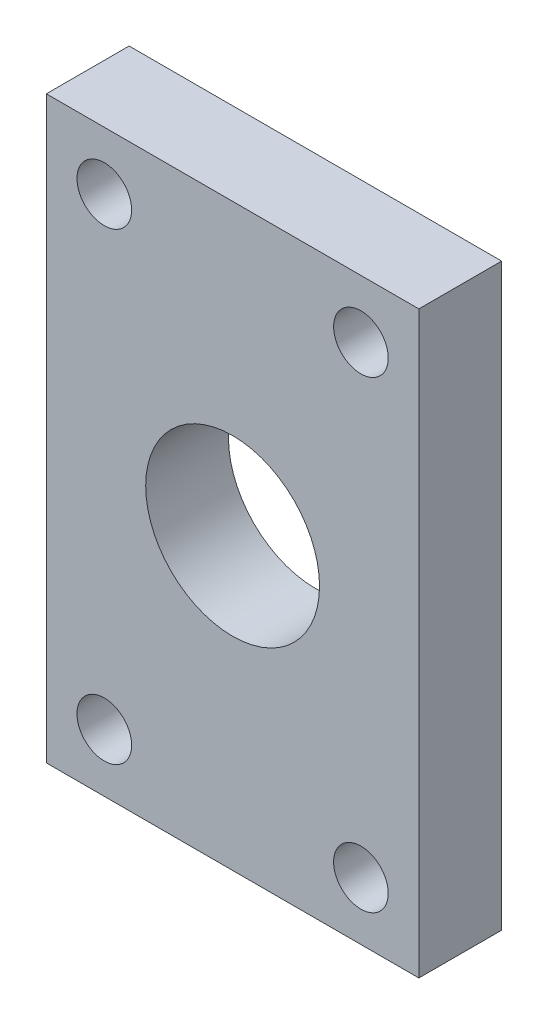
ISO-10303-21;
HEADER;
FILE_DESCRIPTION(('STEP AP214'),'2;1');
FILE_NAME('part.step','',(''),(''),'','','');
FILE_SCHEMA(('AUTOMOTIVE_DESIGN { 1 0 10303 214 1 1 1 1 }'));
ENDSEC;
DATA;
#1=APPLICATION_CONTEXT('core data for automotive mechanical design processes');
#2=APPLICATION_PROTOCOL_DEFINITION('international standard','automotive_design',2000,#1);
#3=PRODUCT_CONTEXT('',#1,'mechanical');
#4=PRODUCT('Part','Part','',(#3));
#5=PRODUCT_RELATED_PRODUCT_CATEGORY('part','',(#4));
#6=PRODUCT_DEFINITION_FORMATION('','',#4);
#7=PRODUCT_DEFINITION_CONTEXT('part definition',#1,'design');
#8=PRODUCT_DEFINITION('design','',#6,#7);
#9=PRODUCT_DEFINITION_SHAPE('','',#8);
#10=(LENGTH_UNIT() NAMED_UNIT(*) SI_UNIT(.MILLI.,.METRE.));
#11=(NAMED_UNIT(*) PLANE_ANGLE_UNIT() SI_UNIT($,.RADIAN.));
#12=(NAMED_UNIT(*) SI_UNIT($,.STERADIAN.) SOLID_ANGLE_UNIT());
#13=UNCERTAINTY_MEASURE_WITH_UNIT(LENGTH_MEASURE(1.E-05),#10,'distance_accuracy_value','');
#14=(GEOMETRIC_REPRESENTATION_CONTEXT(3) GLOBAL_UNCERTAINTY_ASSIGNED_CONTEXT((#13)) GLOBAL_UNIT_ASSIGNED_CONTEXT((#10,
#11,#12)) REPRESENTATION_CONTEXT('',''));
#15=CARTESIAN_POINT('',(0.,0.,0.));
#16=DIRECTION('',(0.,0.,1.));
#17=DIRECTION('',(1.,0.,0.));
#18=AXIS2_PLACEMENT_3D('',#15,#16,#17);
#19=CARTESIAN_POINT('',(0.,0.,-10.));
#20=DIRECTION('',(-1.,0.,0.));
#21=DIRECTION('',(0.,0.,1.));
#22=AXIS2_PLACEMENT_3D('',#19,#20,#21);
#23=PLANE('',#22);
#24=DIRECTION('',(0.,-1.,0.));
#25=VECTOR('',#24,1.);
#26=CARTESIAN_POINT('',(0.,0.,0.));
#27=LINE('',#26,#25);
#28=CARTESIAN_POINT('',(0.,70.,0.));
#29=VERTEX_POINT('',#28);
#30=CARTESIAN_POINT('',(0.,0.,0.));
#31=VERTEX_POINT('',#30);
#32=EDGE_CURVE('E97',#29,#31,#27,.T.);
#33=ORIENTED_EDGE('',*,*,#32,.F.);
#34=DIRECTION('',(0.,0.,1.));
#35=VECTOR('',#34,1.);
#36=CARTESIAN_POINT('',(0.,70.,-10.));
#37=LINE('',#36,#35);
#38=CARTESIAN_POINT('',(0.,70.,-10.));
#39=VERTEX_POINT('',#38);
#40=EDGE_CURVE('E11',#39,#29,#37,.T.);
#41=ORIENTED_EDGE('',*,*,#40,.F.);
#42=DIRECTION('',(0.,-1.,0.));
#43=VECTOR('',#42,1.);
#44=CARTESIAN_POINT('',(0.,0.,-10.));
#45=LINE('',#44,#43);
#46=CARTESIAN_POINT('',(0.,0.,-10.));
#47=VERTEX_POINT('',#46);
#48=EDGE_CURVE('E90',#39,#47,#45,.T.);
#49=ORIENTED_EDGE('',*,*,#48,.T.);
#50=DIRECTION('',(0.,0.,1.));
#51=VECTOR('',#50,1.);
#52=CARTESIAN_POINT('',(0.,0.,-10.));
#53=LINE('',#52,#51);
#54=EDGE_CURVE('E35',#47,#31,#53,.T.);
#55=ORIENTED_EDGE('',*,*,#54,.T.);
#56=EDGE_LOOP('',(#33,#41,#49,#55));
#57=FACE_BOUND('',#56,.T.);
#58=ADVANCED_FACE('F32',(#57),#23,.T.);
#59=CARTESIAN_POINT('',(0.,70.,-10.));
#60=DIRECTION('',(0.,1.,0.));
#61=DIRECTION('',(0.,0.,1.));
#62=AXIS2_PLACEMENT_3D('',#59,#60,#61);
#63=PLANE('',#62);
#64=DIRECTION('',(-1.,0.,0.));
#65=VECTOR('',#64,1.);
#66=CARTESIAN_POINT('',(0.,70.,0.));
#67=LINE('',#66,#65);
#68=CARTESIAN_POINT('',(45.,70.,0.));
#69=VERTEX_POINT('',#68);
#70=EDGE_CURVE('E92',#69,#29,#67,.T.);
#71=ORIENTED_EDGE('',*,*,#70,.F.);
#72=DIRECTION('',(0.,0.,1.));
#73=VECTOR('',#72,1.);
#74=CARTESIAN_POINT('',(45.,70.,-10.));
#75=LINE('',#74,#73);
#76=CARTESIAN_POINT('',(45.,70.,-10.));
#77=VERTEX_POINT('',#76);
#78=EDGE_CURVE('E41',#77,#69,#75,.T.);
#79=ORIENTED_EDGE('',*,*,#78,.F.);
#80=DIRECTION('',(-1.,0.,0.));
#81=VECTOR('',#80,1.);
#82=CARTESIAN_POINT('',(0.,70.,-10.));
#83=LINE('',#82,#81);
#84=EDGE_CURVE('E87',#77,#39,#83,.T.);
#85=ORIENTED_EDGE('',*,*,#84,.T.);
#86=ORIENTED_EDGE('',*,*,#40,.T.);
#87=EDGE_LOOP('',(#71,#79,#85,#86));
#88=FACE_BOUND('',#87,.T.);
#89=ADVANCED_FACE('F108',(#88),#63,.T.);
#90=CARTESIAN_POINT('',(45.,0.,-10.));
#91=DIRECTION('',(1.,0.,0.));
#92=DIRECTION('',(0.,0.,-1.));
#93=AXIS2_PLACEMENT_3D('',#90,#91,#92);
#94=PLANE('',#93);
#95=DIRECTION('',(0.,1.,0.));
#96=VECTOR('',#95,1.);
#97=CARTESIAN_POINT('',(45.,0.,0.));
#98=LINE('',#97,#96);
#99=CARTESIAN_POINT('',(45.,0.,0.));
#100=VERTEX_POINT('',#99);
#101=EDGE_CURVE('E82',#100,#69,#98,.T.);
#102=ORIENTED_EDGE('',*,*,#101,.F.);
#103=DIRECTION('',(0.,0.,1.));
#104=VECTOR('',#103,1.);
#105=CARTESIAN_POINT('',(45.,0.,-10.));
#106=LINE('',#105,#104);
#107=CARTESIAN_POINT('',(45.,0.,-10.));
#108=VERTEX_POINT('',#107);
#109=EDGE_CURVE('E77',#108,#100,#106,.T.);
#110=ORIENTED_EDGE('',*,*,#109,.F.);
#111=DIRECTION('',(0.,1.,0.));
#112=VECTOR('',#111,1.);
#113=CARTESIAN_POINT('',(45.,0.,-10.));
#114=LINE('',#113,#112);
#115=EDGE_CURVE('E80',#108,#77,#114,.T.);
#116=ORIENTED_EDGE('',*,*,#115,.T.);
#117=ORIENTED_EDGE('',*,*,#78,.T.);
#118=EDGE_LOOP('',(#102,#110,#116,#117));
#119=FACE_BOUND('',#118,.T.);
#120=ADVANCED_FACE('F79',(#119),#94,.T.);
#121=CARTESIAN_POINT('',(0.,0.,-10.));
#122=DIRECTION('',(0.,-1.,0.));
#123=DIRECTION('',(0.,0.,-1.));
#124=AXIS2_PLACEMENT_3D('',#121,#122,#123);
#125=PLANE('',#124);
#126=DIRECTION('',(1.,0.,0.));
#127=VECTOR('',#126,1.);
#128=CARTESIAN_POINT('',(0.,0.,0.));
#129=LINE('',#128,#127);
#130=EDGE_CURVE('E100',#31,#100,#129,.T.);
#131=ORIENTED_EDGE('',*,*,#130,.F.);
#132=ORIENTED_EDGE('',*,*,#54,.F.);
#133=DIRECTION('',(1.,0.,0.));
#134=VECTOR('',#133,1.);
#135=CARTESIAN_POINT('',(0.,0.,-10.));
#136=LINE('',#135,#134);
#137=EDGE_CURVE('E86',#47,#108,#136,.T.);
#138=ORIENTED_EDGE('',*,*,#137,.T.);
#139=ORIENTED_EDGE('',*,*,#109,.T.);
#140=EDGE_LOOP('',(#131,#132,#138,#139));
#141=FACE_BOUND('',#140,.T.);
#142=ADVANCED_FACE('F89',(#141),#125,.T.);
#143=CARTESIAN_POINT('',(0.,0.,-10.));
#144=DIRECTION('',(0.,0.,-1.));
#145=DIRECTION('',(-1.,0.,0.));
#146=AXIS2_PLACEMENT_3D('',#143,#144,#145);
#147=PLANE('',#146);
#148=CARTESIAN_POINT('',(7.,63.,-10.));
#149=DIRECTION('',(0.,0.,1.));
#150=DIRECTION('',(1.,0.,0.));
#151=AXIS2_PLACEMENT_3D('',#148,#149,#150);
#152=CIRCLE('',#151,3.29999999999999);
#153=CARTESIAN_POINT('',(10.3,63.,-10.));
#154=VERTEX_POINT('',#153);
#155=EDGE_CURVE('E153',#154,#154,#152,.T.);
#156=ORIENTED_EDGE('',*,*,#155,.T.);
#157=EDGE_LOOP('',(#156));
#158=FACE_BOUND('',#157,.T.);
#159=CARTESIAN_POINT('',(6.99999999999999,7.,-10.));
#160=DIRECTION('',(0.,0.,1.));
#161=DIRECTION('',(-1.,0.,0.));
#162=AXIS2_PLACEMENT_3D('',#159,#160,#161);
#163=CIRCLE('',#162,3.30000000000001);
#164=CARTESIAN_POINT('',(3.69999999999998,7.,-10.));
#165=VERTEX_POINT('',#164);
#166=EDGE_CURVE('E161',#165,#165,#163,.T.);
#167=ORIENTED_EDGE('',*,*,#166,.T.);
#168=EDGE_LOOP('',(#167));
#169=FACE_BOUND('',#168,.T.);
#170=CARTESIAN_POINT('',(38.,63.,-10.));
#171=DIRECTION('',(0.,0.,1.));
#172=DIRECTION('',(-1.,0.,0.));
#173=AXIS2_PLACEMENT_3D('',#170,#171,#172);
#174=CIRCLE('',#173,3.29999999999999);
#175=CARTESIAN_POINT('',(34.7,63.,-10.));
#176=VERTEX_POINT('',#175);
#177=EDGE_CURVE('E167',#176,#176,#174,.T.);
#178=ORIENTED_EDGE('',*,*,#177,.T.);
#179=EDGE_LOOP('',(#178));
#180=FACE_BOUND('',#179,.T.);
#181=CARTESIAN_POINT('',(38.,7.,-10.));
#182=DIRECTION('',(0.,0.,1.));
#183=DIRECTION('',(1.,0.,0.));
#184=AXIS2_PLACEMENT_3D('',#181,#182,#183);
#185=CIRCLE('',#184,3.3);
#186=CARTESIAN_POINT('',(41.3,7.,-10.));
#187=VERTEX_POINT('',#186);
#188=EDGE_CURVE('E173',#187,#187,#185,.T.);
#189=ORIENTED_EDGE('',*,*,#188,.T.);
#190=EDGE_LOOP('',(#189));
#191=FACE_BOUND('',#190,.T.);
#192=CARTESIAN_POINT('',(22.5,35.,-10.));
#193=DIRECTION('',(0.,0.,1.));
#194=DIRECTION('',(1.,0.,0.));
#195=AXIS2_PLACEMENT_3D('',#192,#193,#194);
#196=CIRCLE('',#195,10.5);
#197=CARTESIAN_POINT('',(33.,35.,-10.));
#198=VERTEX_POINT('',#197);
#199=EDGE_CURVE('E101',#198,#198,#196,.T.);
#200=ORIENTED_EDGE('',*,*,#199,.T.);
#201=EDGE_LOOP('',(#200));
#202=FACE_BOUND('',#201,.T.);
#203=ORIENTED_EDGE('',*,*,#48,.F.);
#204=ORIENTED_EDGE('',*,*,#84,.F.);
#205=ORIENTED_EDGE('',*,*,#115,.F.);
#206=ORIENTED_EDGE('',*,*,#137,.F.);
#207=EDGE_LOOP('',(#203,#204,#205,#206));
#208=FACE_BOUND('',#207,.T.);
#209=ADVANCED_FACE('F85',(#158,#169,#180,#191,#202,#208),#147,.T.);
#210=CARTESIAN_POINT('',(0.,0.,0.));
#211=DIRECTION('',(0.,0.,-1.));
#212=DIRECTION('',(-1.,0.,0.));
#213=AXIS2_PLACEMENT_3D('',#210,#211,#212);
#214=PLANE('',#213);
#215=CARTESIAN_POINT('',(7.,63.,0.));
#216=DIRECTION('',(0.,0.,1.));
#217=DIRECTION('',(1.,0.,0.));
#218=AXIS2_PLACEMENT_3D('',#215,#216,#217);
#219=CIRCLE('',#218,3.29999999999999);
#220=CARTESIAN_POINT('',(10.3,63.,0.));
#221=VERTEX_POINT('',#220);
#222=EDGE_CURVE('E156',#221,#221,#219,.T.);
#223=ORIENTED_EDGE('',*,*,#222,.F.);
#224=EDGE_LOOP('',(#223));
#225=FACE_BOUND('',#224,.T.);
#226=CARTESIAN_POINT('',(6.99999999999999,7.,0.));
#227=DIRECTION('',(0.,0.,1.));
#228=DIRECTION('',(-1.,0.,0.));
#229=AXIS2_PLACEMENT_3D('',#226,#227,#228);
#230=CIRCLE('',#229,3.30000000000001);
#231=CARTESIAN_POINT('',(3.69999999999998,7.,0.));
#232=VERTEX_POINT('',#231);
#233=EDGE_CURVE('E158',#232,#232,#230,.T.);
#234=ORIENTED_EDGE('',*,*,#233,.F.);
#235=EDGE_LOOP('',(#234));
#236=FACE_BOUND('',#235,.T.);
#237=CARTESIAN_POINT('',(38.,63.,0.));
#238=DIRECTION('',(0.,0.,1.));
#239=DIRECTION('',(-1.,0.,0.));
#240=AXIS2_PLACEMENT_3D('',#237,#238,#239);
#241=CIRCLE('',#240,3.29999999999999);
#242=CARTESIAN_POINT('',(34.7,63.,0.));
#243=VERTEX_POINT('',#242);
#244=EDGE_CURVE('E164',#243,#243,#241,.T.);
#245=ORIENTED_EDGE('',*,*,#244,.F.);
#246=EDGE_LOOP('',(#245));
#247=FACE_BOUND('',#246,.T.);
#248=CARTESIAN_POINT('',(38.,7.,0.));
#249=DIRECTION('',(0.,0.,1.));
#250=DIRECTION('',(1.,0.,0.));
#251=AXIS2_PLACEMENT_3D('',#248,#249,#250);
#252=CIRCLE('',#251,3.3);
#253=CARTESIAN_POINT('',(41.3,7.,0.));
#254=VERTEX_POINT('',#253);
#255=EDGE_CURVE('E170',#254,#254,#252,.T.);
#256=ORIENTED_EDGE('',*,*,#255,.F.);
#257=EDGE_LOOP('',(#256));
#258=FACE_BOUND('',#257,.T.);
#259=CARTESIAN_POINT('',(22.5,35.,0.));
#260=DIRECTION('',(0.,0.,1.));
#261=DIRECTION('',(1.,0.,0.));
#262=AXIS2_PLACEMENT_3D('',#259,#260,#261);
#263=CIRCLE('',#262,10.5);
#264=CARTESIAN_POINT('',(33.,35.,0.));
#265=VERTEX_POINT('',#264);
#266=EDGE_CURVE('E176',#265,#265,#263,.T.);
#267=ORIENTED_EDGE('',*,*,#266,.F.);
#268=EDGE_LOOP('',(#267));
#269=FACE_BOUND('',#268,.T.);
#270=ORIENTED_EDGE('',*,*,#32,.T.);
#271=ORIENTED_EDGE('',*,*,#130,.T.);
#272=ORIENTED_EDGE('',*,*,#101,.T.);
#273=ORIENTED_EDGE('',*,*,#70,.T.);
#274=EDGE_LOOP('',(#270,#271,#272,#273));
#275=FACE_BOUND('',#274,.T.);
#276=ADVANCED_FACE('F107',(#225,#236,#247,#258,#269,#275),#214,.F.);
#277=CARTESIAN_POINT('',(22.5,35.,-10.));
#278=DIRECTION('',(0.,0.,1.));
#279=DIRECTION('',(1.,0.,0.));
#280=AXIS2_PLACEMENT_3D('',#277,#278,#279);
#281=CYLINDRICAL_SURFACE('',#280,10.5);
#282=ORIENTED_EDGE('',*,*,#199,.F.);
#283=EDGE_LOOP('',(#282));
#284=FACE_BOUND('',#283,.T.);
#285=ORIENTED_EDGE('',*,*,#266,.T.);
#286=EDGE_LOOP('',(#285));
#287=FACE_BOUND('',#286,.T.);
#288=ADVANCED_FACE('F126',(#284,#287),#281,.F.);
#289=CARTESIAN_POINT('',(38.,7.,-10.));
#290=DIRECTION('',(0.,0.,1.));
#291=DIRECTION('',(1.,0.,0.));
#292=AXIS2_PLACEMENT_3D('',#289,#290,#291);
#293=CYLINDRICAL_SURFACE('',#292,3.3);
#294=ORIENTED_EDGE('',*,*,#188,.F.);
#295=EDGE_LOOP('',(#294));
#296=FACE_BOUND('',#295,.T.);
#297=ORIENTED_EDGE('',*,*,#255,.T.);
#298=EDGE_LOOP('',(#297));
#299=FACE_BOUND('',#298,.T.);
#300=ADVANCED_FACE('F133',(#296,#299),#293,.F.);
#301=CARTESIAN_POINT('',(38.,63.,-10.));
#302=DIRECTION('',(0.,0.,1.));
#303=DIRECTION('',(1.,0.,0.));
#304=AXIS2_PLACEMENT_3D('',#301,#302,#303);
#305=CYLINDRICAL_SURFACE('',#304,3.29999999999999);
#306=ORIENTED_EDGE('',*,*,#177,.F.);
#307=EDGE_LOOP('',(#306));
#308=FACE_BOUND('',#307,.T.);
#309=ORIENTED_EDGE('',*,*,#244,.T.);
#310=EDGE_LOOP('',(#309));
#311=FACE_BOUND('',#310,.T.);
#312=ADVANCED_FACE('F137',(#308,#311),#305,.F.);
#313=CARTESIAN_POINT('',(6.99999999999999,7.,-10.));
#314=DIRECTION('',(0.,0.,1.));
#315=DIRECTION('',(1.,0.,0.));
#316=AXIS2_PLACEMENT_3D('',#313,#314,#315);
#317=CYLINDRICAL_SURFACE('',#316,3.30000000000001);
#318=ORIENTED_EDGE('',*,*,#166,.F.);
#319=EDGE_LOOP('',(#318));
#320=FACE_BOUND('',#319,.T.);
#321=ORIENTED_EDGE('',*,*,#233,.T.);
#322=EDGE_LOOP('',(#321));
#323=FACE_BOUND('',#322,.T.);
#324=ADVANCED_FACE('F141',(#320,#323),#317,.F.);
#325=CARTESIAN_POINT('',(7.,63.,-10.));
#326=DIRECTION('',(0.,0.,1.));
#327=DIRECTION('',(1.,0.,0.));
#328=AXIS2_PLACEMENT_3D('',#325,#326,#327);
#329=CYLINDRICAL_SURFACE('',#328,3.29999999999999);
#330=ORIENTED_EDGE('',*,*,#155,.F.);
#331=EDGE_LOOP('',(#330));
#332=FACE_BOUND('',#331,.T.);
#333=ORIENTED_EDGE('',*,*,#222,.T.);
#334=EDGE_LOOP('',(#333));
#335=FACE_BOUND('',#334,.T.);
#336=ADVANCED_FACE('F145',(#332,#335),#329,.F.);
#337=CLOSED_SHELL('',(#58,#89,#120,#142,#209,#276,#288,#300,#312,#324,#336));
#338=MANIFOLD_SOLID_BREP('B2',#337);
#339=ADVANCED_BREP_SHAPE_REPRESENTATION('',(#18,#338),#14);
#340=SHAPE_DEFINITION_REPRESENTATION(#9,#339);
ENDSEC;
END-ISO-10303-21;
